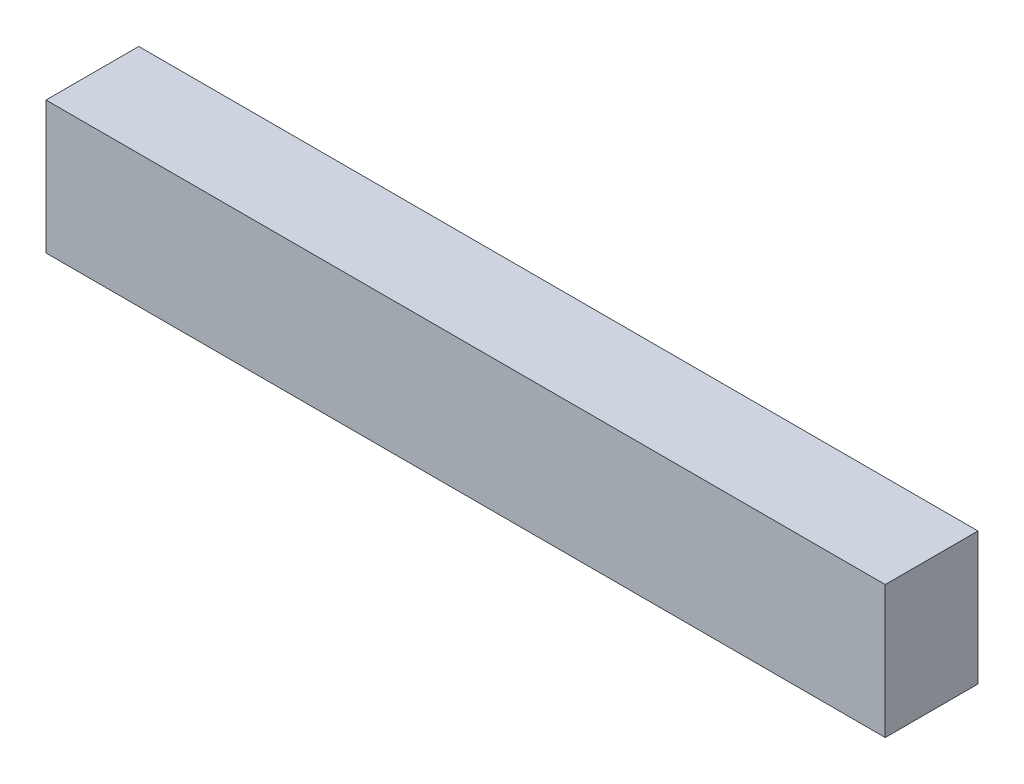
ISO-10303-21;
HEADER;
FILE_DESCRIPTION(('STEP AP214'),'2;1');
FILE_NAME('part.step','',(''),(''),'','','');
FILE_SCHEMA(('AUTOMOTIVE_DESIGN { 1 0 10303 214 1 1 1 1 }'));
ENDSEC;
DATA;
#1=APPLICATION_CONTEXT('core data for automotive mechanical design processes');
#2=APPLICATION_PROTOCOL_DEFINITION('international standard','automotive_design',2000,#1);
#3=PRODUCT_CONTEXT('',#1,'mechanical');
#4=PRODUCT('Part','Part','',(#3));
#5=PRODUCT_RELATED_PRODUCT_CATEGORY('part','',(#4));
#6=PRODUCT_DEFINITION_FORMATION('','',#4);
#7=PRODUCT_DEFINITION_CONTEXT('part definition',#1,'design');
#8=PRODUCT_DEFINITION('design','',#6,#7);
#9=PRODUCT_DEFINITION_SHAPE('','',#8);
#10=(LENGTH_UNIT() NAMED_UNIT(*) SI_UNIT(.MILLI.,.METRE.));
#11=(NAMED_UNIT(*) PLANE_ANGLE_UNIT() SI_UNIT($,.RADIAN.));
#12=(NAMED_UNIT(*) SI_UNIT($,.STERADIAN.) SOLID_ANGLE_UNIT());
#13=UNCERTAINTY_MEASURE_WITH_UNIT(LENGTH_MEASURE(1.E-05),#10,'distance_accuracy_value','');
#14=(GEOMETRIC_REPRESENTATION_CONTEXT(3) GLOBAL_UNCERTAINTY_ASSIGNED_CONTEXT((#13)) GLOBAL_UNIT_ASSIGNED_CONTEXT((#10,
#11,#12)) REPRESENTATION_CONTEXT('',''));
#15=CARTESIAN_POINT('',(0.,0.,0.));
#16=DIRECTION('',(0.,0.,1.));
#17=DIRECTION('',(1.,0.,0.));
#18=AXIS2_PLACEMENT_3D('',#15,#16,#17);
#19=CARTESIAN_POINT('',(-34.4607665376516,13.5095063199604,5.334));
#20=DIRECTION('',(1.,0.,0.));
#21=DIRECTION('',(0.,0.,-1.));
#22=AXIS2_PLACEMENT_3D('',#19,#20,#21);
#23=PLANE('',#22);
#24=DIRECTION('',(0.,-1.,0.));
#25=VECTOR('',#24,1.);
#26=CARTESIAN_POINT('',(-34.4607665376516,13.5095063199604,0.));
#27=LINE('',#26,#25);
#28=CARTESIAN_POINT('',(-34.4607665376516,13.5095063199604,0.));
#29=VERTEX_POINT('',#28);
#30=CARTESIAN_POINT('',(-34.4607665376516,5.8895063199604,0.));
#31=VERTEX_POINT('',#30);
#32=EDGE_CURVE('E97',#29,#31,#27,.T.);
#33=ORIENTED_EDGE('',*,*,#32,.T.);
#34=DIRECTION('',(0.,0.,-1.));
#35=VECTOR('',#34,1.);
#36=CARTESIAN_POINT('',(-34.4607665376516,5.8895063199604,5.334));
#37=LINE('',#36,#35);
#38=CARTESIAN_POINT('',(-34.4607665376516,5.8895063199604,5.334));
#39=VERTEX_POINT('',#38);
#40=EDGE_CURVE('E11',#39,#31,#37,.T.);
#41=ORIENTED_EDGE('',*,*,#40,.F.);
#42=DIRECTION('',(0.,-1.,0.));
#43=VECTOR('',#42,1.);
#44=CARTESIAN_POINT('',(-34.4607665376516,13.5095063199604,5.334));
#45=LINE('',#44,#43);
#46=CARTESIAN_POINT('',(-34.4607665376516,13.5095063199604,5.334));
#47=VERTEX_POINT('',#46);
#48=EDGE_CURVE('E85',#47,#39,#45,.T.);
#49=ORIENTED_EDGE('',*,*,#48,.F.);
#50=DIRECTION('',(0.,0.,-1.));
#51=VECTOR('',#50,1.);
#52=CARTESIAN_POINT('',(-34.4607665376516,13.5095063199604,5.334));
#53=LINE('',#52,#51);
#54=EDGE_CURVE('E93',#47,#29,#53,.T.);
#55=ORIENTED_EDGE('',*,*,#54,.T.);
#56=EDGE_LOOP('',(#33,#41,#49,#55));
#57=FACE_BOUND('',#56,.T.);
#58=ADVANCED_FACE('F34',(#57),#23,.F.);
#59=CARTESIAN_POINT('',(-34.4607665376516,5.8895063199604,5.334));
#60=DIRECTION('',(0.,1.,0.));
#61=DIRECTION('',(0.,0.,1.));
#62=AXIS2_PLACEMENT_3D('',#59,#60,#61);
#63=PLANE('',#62);
#64=DIRECTION('',(1.,0.,0.));
#65=VECTOR('',#64,1.);
#66=CARTESIAN_POINT('',(-34.4607665376516,5.8895063199604,0.));
#67=LINE('',#66,#65);
#68=CARTESIAN_POINT('',(13.7992334623484,5.8895063199604,0.));
#69=VERTEX_POINT('',#68);
#70=EDGE_CURVE('E89',#31,#69,#67,.T.);
#71=ORIENTED_EDGE('',*,*,#70,.T.);
#72=DIRECTION('',(0.,0.,-1.));
#73=VECTOR('',#72,1.);
#74=CARTESIAN_POINT('',(13.7992334623484,5.8895063199604,5.334));
#75=LINE('',#74,#73);
#76=CARTESIAN_POINT('',(13.7992334623484,5.8895063199604,5.334));
#77=VERTEX_POINT('',#76);
#78=EDGE_CURVE('E42',#77,#69,#75,.T.);
#79=ORIENTED_EDGE('',*,*,#78,.F.);
#80=DIRECTION('',(1.,0.,0.));
#81=VECTOR('',#80,1.);
#82=CARTESIAN_POINT('',(-34.4607665376516,5.8895063199604,5.334));
#83=LINE('',#82,#81);
#84=EDGE_CURVE('E80',#39,#77,#83,.T.);
#85=ORIENTED_EDGE('',*,*,#84,.F.);
#86=ORIENTED_EDGE('',*,*,#40,.T.);
#87=EDGE_LOOP('',(#71,#79,#85,#86));
#88=FACE_BOUND('',#87,.T.);
#89=ADVANCED_FACE('F88',(#88),#63,.F.);
#90=CARTESIAN_POINT('',(13.7992334623484,13.5095063199604,5.334));
#91=DIRECTION('',(-1.,0.,0.));
#92=DIRECTION('',(0.,-1.,0.));
#93=AXIS2_PLACEMENT_3D('',#90,#91,#92);
#94=PLANE('',#93);
#95=DIRECTION('',(0.,1.,0.));
#96=VECTOR('',#95,1.);
#97=CARTESIAN_POINT('',(13.7992334623484,13.5095063199604,0.));
#98=LINE('',#97,#96);
#99=CARTESIAN_POINT('',(13.7992334623484,13.5095063199604,0.));
#100=VERTEX_POINT('',#99);
#101=EDGE_CURVE('E67',#69,#100,#98,.T.);
#102=ORIENTED_EDGE('',*,*,#101,.T.);
#103=DIRECTION('',(0.,0.,-1.));
#104=VECTOR('',#103,1.);
#105=CARTESIAN_POINT('',(13.7992334623484,13.5095063199604,5.334));
#106=LINE('',#105,#104);
#107=CARTESIAN_POINT('',(13.7992334623484,13.5095063199604,5.334));
#108=VERTEX_POINT('',#107);
#109=EDGE_CURVE('E90',#108,#100,#106,.T.);
#110=ORIENTED_EDGE('',*,*,#109,.F.);
#111=DIRECTION('',(0.,1.,0.));
#112=VECTOR('',#111,1.);
#113=CARTESIAN_POINT('',(13.7992334623484,13.5095063199604,5.334));
#114=LINE('',#113,#112);
#115=EDGE_CURVE('E83',#77,#108,#114,.T.);
#116=ORIENTED_EDGE('',*,*,#115,.F.);
#117=ORIENTED_EDGE('',*,*,#78,.T.);
#118=EDGE_LOOP('',(#102,#110,#116,#117));
#119=FACE_BOUND('',#118,.T.);
#120=ADVANCED_FACE('F91',(#119),#94,.F.);
#121=CARTESIAN_POINT('',(-34.4607665376516,13.5095063199604,5.334));
#122=DIRECTION('',(0.,-1.,0.));
#123=DIRECTION('',(0.,0.,-1.));
#124=AXIS2_PLACEMENT_3D('',#121,#122,#123);
#125=PLANE('',#124);
#126=DIRECTION('',(-1.,0.,0.));
#127=VECTOR('',#126,1.);
#128=CARTESIAN_POINT('',(-34.4607665376516,13.5095063199604,0.));
#129=LINE('',#128,#127);
#130=EDGE_CURVE('E73',#100,#29,#129,.T.);
#131=ORIENTED_EDGE('',*,*,#130,.T.);
#132=ORIENTED_EDGE('',*,*,#54,.F.);
#133=DIRECTION('',(-1.,0.,0.));
#134=VECTOR('',#133,1.);
#135=CARTESIAN_POINT('',(-34.4607665376516,13.5095063199604,5.334));
#136=LINE('',#135,#134);
#137=EDGE_CURVE('E50',#108,#47,#136,.T.);
#138=ORIENTED_EDGE('',*,*,#137,.F.);
#139=ORIENTED_EDGE('',*,*,#109,.T.);
#140=EDGE_LOOP('',(#131,#132,#138,#139));
#141=FACE_BOUND('',#140,.T.);
#142=ADVANCED_FACE('F104',(#141),#125,.F.);
#143=CARTESIAN_POINT('',(0.,0.,5.334));
#144=DIRECTION('',(0.,0.,1.));
#145=DIRECTION('',(1.,0.,0.));
#146=AXIS2_PLACEMENT_3D('',#143,#144,#145);
#147=PLANE('',#146);
#148=ORIENTED_EDGE('',*,*,#48,.T.);
#149=ORIENTED_EDGE('',*,*,#84,.T.);
#150=ORIENTED_EDGE('',*,*,#115,.T.);
#151=ORIENTED_EDGE('',*,*,#137,.T.);
#152=EDGE_LOOP('',(#148,#149,#150,#151));
#153=FACE_BOUND('',#152,.T.);
#154=ADVANCED_FACE('F81',(#153),#147,.T.);
#155=CARTESIAN_POINT('',(0.,0.,0.));
#156=DIRECTION('',(0.,0.,1.));
#157=DIRECTION('',(1.,0.,0.));
#158=AXIS2_PLACEMENT_3D('',#155,#156,#157);
#159=PLANE('',#158);
#160=ORIENTED_EDGE('',*,*,#32,.F.);
#161=ORIENTED_EDGE('',*,*,#130,.F.);
#162=ORIENTED_EDGE('',*,*,#101,.F.);
#163=ORIENTED_EDGE('',*,*,#70,.F.);
#164=EDGE_LOOP('',(#160,#161,#162,#163));
#165=FACE_BOUND('',#164,.T.);
#166=ADVANCED_FACE('F107',(#165),#159,.F.);
#167=CLOSED_SHELL('',(#58,#89,#120,#142,#154,#166));
#168=MANIFOLD_SOLID_BREP('B2',#167);
#169=ADVANCED_BREP_SHAPE_REPRESENTATION('',(#18,#168),#14);
#170=SHAPE_DEFINITION_REPRESENTATION(#9,#169);
ENDSEC;
END-ISO-10303-21;
